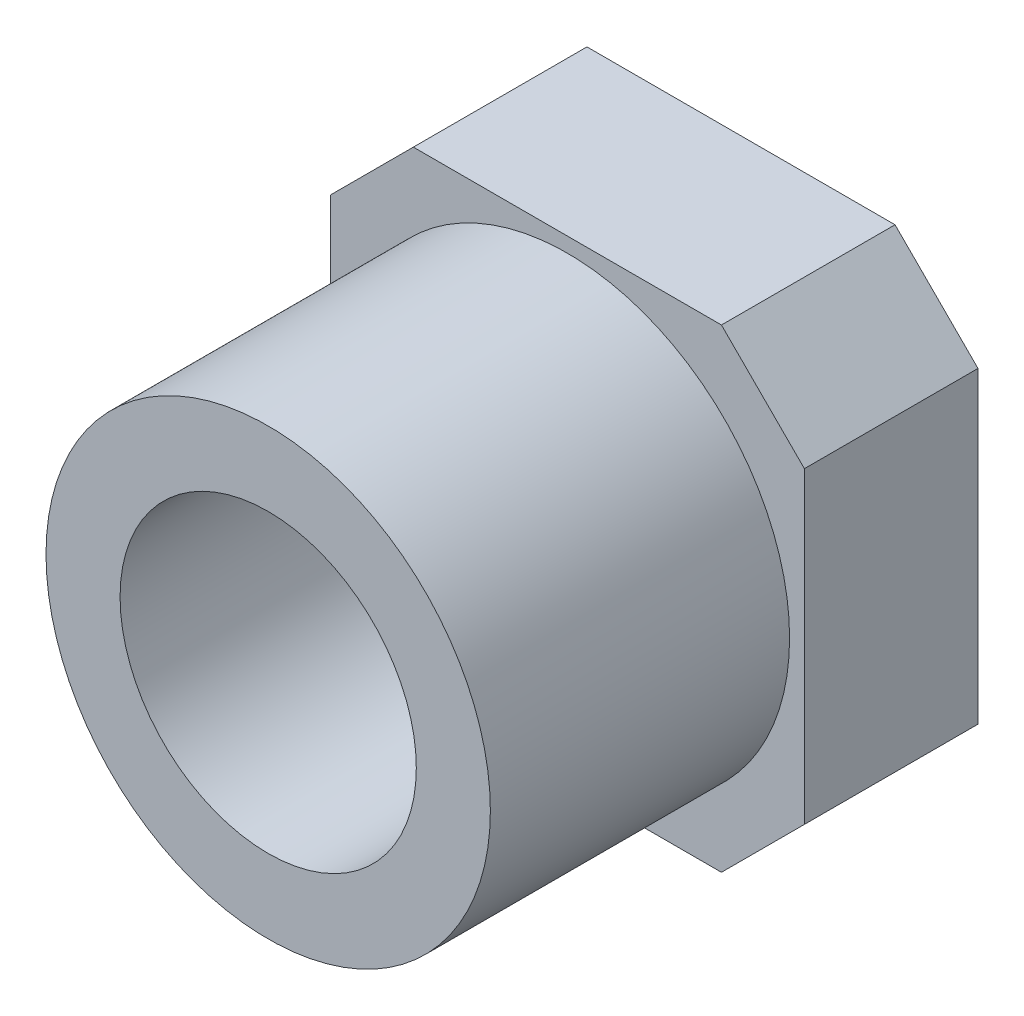
ISO-10303-21;
HEADER;
FILE_DESCRIPTION(('STEP AP214'),'2;1');
FILE_NAME('part.step','',(''),(''),'','','');
FILE_SCHEMA(('AUTOMOTIVE_DESIGN { 1 0 10303 214 1 1 1 1 }'));
ENDSEC;
DATA;
#1=APPLICATION_CONTEXT('core data for automotive mechanical design processes');
#2=APPLICATION_PROTOCOL_DEFINITION('international standard','automotive_design',2000,#1);
#3=PRODUCT_CONTEXT('',#1,'mechanical');
#4=PRODUCT('Part','Part','',(#3));
#5=PRODUCT_RELATED_PRODUCT_CATEGORY('part','',(#4));
#6=PRODUCT_DEFINITION_FORMATION('','',#4);
#7=PRODUCT_DEFINITION_CONTEXT('part definition',#1,'design');
#8=PRODUCT_DEFINITION('design','',#6,#7);
#9=PRODUCT_DEFINITION_SHAPE('','',#8);
#10=(LENGTH_UNIT() NAMED_UNIT(*) SI_UNIT(.MILLI.,.METRE.));
#11=(NAMED_UNIT(*) PLANE_ANGLE_UNIT() SI_UNIT($,.RADIAN.));
#12=(NAMED_UNIT(*) SI_UNIT($,.STERADIAN.) SOLID_ANGLE_UNIT());
#13=UNCERTAINTY_MEASURE_WITH_UNIT(LENGTH_MEASURE(1.E-05),#10,'distance_accuracy_value','');
#14=(GEOMETRIC_REPRESENTATION_CONTEXT(3) GLOBAL_UNCERTAINTY_ASSIGNED_CONTEXT((#13)) GLOBAL_UNIT_ASSIGNED_CONTEXT((#10,
#11,#12)) REPRESENTATION_CONTEXT('',''));
#15=CARTESIAN_POINT('',(0.,0.,0.));
#16=DIRECTION('',(0.,0.,1.));
#17=DIRECTION('',(1.,0.,0.));
#18=AXIS2_PLACEMENT_3D('',#15,#16,#17);
#19=CARTESIAN_POINT('',(0.,0.,12.827));
#20=DIRECTION('',(0.,0.,1.));
#21=DIRECTION('',(1.,0.,0.));
#22=AXIS2_PLACEMENT_3D('',#19,#20,#21);
#23=PLANE('',#22);
#24=CARTESIAN_POINT('',(0.,0.,12.827));
#25=DIRECTION('',(0.,0.,1.));
#26=DIRECTION('',(1.,0.,0.));
#27=AXIS2_PLACEMENT_3D('',#24,#25,#26);
#28=CIRCLE('',#27,9.525);
#29=CARTESIAN_POINT('',(9.525,0.,12.827));
#30=VERTEX_POINT('',#29);
#31=EDGE_CURVE('E141',#30,#30,#28,.T.);
#32=ORIENTED_EDGE('',*,*,#31,.T.);
#33=EDGE_LOOP('',(#32));
#34=FACE_BOUND('',#33,.T.);
#35=CARTESIAN_POINT('',(0.,0.,12.827));
#36=DIRECTION('',(0.,0.,1.));
#37=DIRECTION('',(1.,0.,0.));
#38=AXIS2_PLACEMENT_3D('',#35,#36,#37);
#39=CIRCLE('',#38,6.35);
#40=CARTESIAN_POINT('',(6.35,0.,12.827));
#41=VERTEX_POINT('',#40);
#42=EDGE_CURVE('E138',#41,#41,#39,.T.);
#43=ORIENTED_EDGE('',*,*,#42,.F.);
#44=EDGE_LOOP('',(#43));
#45=FACE_BOUND('',#44,.T.);
#46=ADVANCED_FACE('F33',(#34,#45),#23,.T.);
#47=CARTESIAN_POINT('',(0.,0.,12.827));
#48=DIRECTION('',(0.,0.,-1.));
#49=DIRECTION('',(-1.,0.,0.));
#50=AXIS2_PLACEMENT_3D('',#47,#48,#49);
#51=CYLINDRICAL_SURFACE('',#50,9.525);
#52=ORIENTED_EDGE('',*,*,#31,.F.);
#53=EDGE_LOOP('',(#52));
#54=FACE_BOUND('',#53,.T.);
#55=CARTESIAN_POINT('',(0.,0.,0.));
#56=DIRECTION('',(0.,0.,1.));
#57=DIRECTION('',(1.,0.,0.));
#58=AXIS2_PLACEMENT_3D('',#55,#56,#57);
#59=CIRCLE('',#58,9.525);
#60=CARTESIAN_POINT('',(9.525,0.,0.));
#61=VERTEX_POINT('',#60);
#62=EDGE_CURVE('E135',#61,#61,#59,.T.);
#63=ORIENTED_EDGE('',*,*,#62,.T.);
#64=EDGE_LOOP('',(#63));
#65=FACE_BOUND('',#64,.T.);
#66=ADVANCED_FACE('F203',(#54,#65),#51,.T.);
#67=CARTESIAN_POINT('',(0.,0.,12.827));
#68=DIRECTION('',(0.,0.,-1.));
#69=DIRECTION('',(-1.,0.,0.));
#70=AXIS2_PLACEMENT_3D('',#67,#68,#69);
#71=CYLINDRICAL_SURFACE('',#70,6.35);
#72=ORIENTED_EDGE('',*,*,#42,.T.);
#73=EDGE_LOOP('',(#72));
#74=FACE_BOUND('',#73,.T.);
#75=CARTESIAN_POINT('',(0.,0.,-7.4422));
#76=DIRECTION('',(0.,0.,-1.));
#77=DIRECTION('',(-1.,0.,0.));
#78=AXIS2_PLACEMENT_3D('',#75,#76,#77);
#79=CIRCLE('',#78,6.35);
#80=CARTESIAN_POINT('',(-6.35,0.,-7.4422));
#81=VERTEX_POINT('',#80);
#82=EDGE_CURVE('E173',#81,#81,#79,.T.);
#83=ORIENTED_EDGE('',*,*,#82,.T.);
#84=EDGE_LOOP('',(#83));
#85=FACE_BOUND('',#84,.T.);
#86=ADVANCED_FACE('F209',(#74,#85),#71,.F.);
#87=CARTESIAN_POINT('',(0.,0.,0.));
#88=DIRECTION('',(0.,0.,1.));
#89=DIRECTION('',(1.,0.,0.));
#90=AXIS2_PLACEMENT_3D('',#87,#88,#89);
#91=PLANE('',#90);
#92=DIRECTION('',(-1.,0.,0.));
#93=VECTOR('',#92,1.);
#94=CARTESIAN_POINT('',(10.16,-10.16,0.));
#95=LINE('',#94,#93);
#96=CARTESIAN_POINT('',(6.604,-10.16,0.));
#97=VERTEX_POINT('',#96);
#98=CARTESIAN_POINT('',(-6.60399999999998,-10.16,0.));
#99=VERTEX_POINT('',#98);
#100=EDGE_CURVE('E116',#97,#99,#95,.T.);
#101=ORIENTED_EDGE('',*,*,#100,.F.);
#102=DIRECTION('',(-0.707106781186546,-0.707106781186549,0.));
#103=VECTOR('',#102,1.);
#104=CARTESIAN_POINT('',(8.38200000000001,-8.38199999999998,0.));
#105=LINE('',#104,#103);
#106=CARTESIAN_POINT('',(10.16,-6.60399999999999,0.));
#107=VERTEX_POINT('',#106);
#108=EDGE_CURVE('E99',#97,#107,#105,.F.);
#109=ORIENTED_EDGE('',*,*,#108,.T.);
#110=DIRECTION('',(0.,-1.,0.));
#111=VECTOR('',#110,1.);
#112=CARTESIAN_POINT('',(10.16,-10.16,0.));
#113=LINE('',#112,#111);
#114=CARTESIAN_POINT('',(10.16,6.604,0.));
#115=VERTEX_POINT('',#114);
#116=EDGE_CURVE('E127',#115,#107,#113,.T.);
#117=ORIENTED_EDGE('',*,*,#116,.F.);
#118=DIRECTION('',(0.707106781186549,-0.707106781186546,0.));
#119=VECTOR('',#118,1.);
#120=CARTESIAN_POINT('',(8.38199999999998,8.38200000000001,0.));
#121=LINE('',#120,#119);
#122=CARTESIAN_POINT('',(6.60399999999999,10.16,0.));
#123=VERTEX_POINT('',#122);
#124=EDGE_CURVE('E120',#115,#123,#121,.F.);
#125=ORIENTED_EDGE('',*,*,#124,.T.);
#126=DIRECTION('',(1.,0.,0.));
#127=VECTOR('',#126,1.);
#128=CARTESIAN_POINT('',(10.16,10.16,0.));
#129=LINE('',#128,#127);
#130=CARTESIAN_POINT('',(-6.604,10.16,0.));
#131=VERTEX_POINT('',#130);
#132=EDGE_CURVE('E131',#131,#123,#129,.T.);
#133=ORIENTED_EDGE('',*,*,#132,.F.);
#134=DIRECTION('',(0.707106781186546,0.707106781186549,0.));
#135=VECTOR('',#134,1.);
#136=CARTESIAN_POINT('',(-8.38200000000002,8.38199999999998,0.));
#137=LINE('',#136,#135);
#138=CARTESIAN_POINT('',(-10.16,6.60399999999999,0.));
#139=VERTEX_POINT('',#138);
#140=EDGE_CURVE('E146',#131,#139,#137,.F.);
#141=ORIENTED_EDGE('',*,*,#140,.T.);
#142=DIRECTION('',(0.,1.,0.));
#143=VECTOR('',#142,1.);
#144=CARTESIAN_POINT('',(-10.16,-10.16,0.));
#145=LINE('',#144,#143);
#146=CARTESIAN_POINT('',(-10.16,-6.604,0.));
#147=VERTEX_POINT('',#146);
#148=EDGE_CURVE('E168',#147,#139,#145,.T.);
#149=ORIENTED_EDGE('',*,*,#148,.F.);
#150=DIRECTION('',(-0.707106781186549,0.707106781186546,0.));
#151=VECTOR('',#150,1.);
#152=CARTESIAN_POINT('',(-8.38199999999998,-8.38200000000001,0.));
#153=LINE('',#152,#151);
#154=EDGE_CURVE('E110',#147,#99,#153,.F.);
#155=ORIENTED_EDGE('',*,*,#154,.T.);
#156=EDGE_LOOP('',(#101,#109,#117,#125,#133,#141,#149,#155));
#157=FACE_BOUND('',#156,.T.);
#158=ORIENTED_EDGE('',*,*,#62,.F.);
#159=EDGE_LOOP('',(#158));
#160=FACE_BOUND('',#159,.T.);
#161=ADVANCED_FACE('F123',(#157,#160),#91,.T.);
#162=CARTESIAN_POINT('',(0.,0.,-7.4422));
#163=DIRECTION('',(0.,0.,1.));
#164=DIRECTION('',(1.,0.,0.));
#165=AXIS2_PLACEMENT_3D('',#162,#163,#164);
#166=PLANE('',#165);
#167=DIRECTION('',(0.,-1.,0.));
#168=VECTOR('',#167,1.);
#169=CARTESIAN_POINT('',(10.16,-10.16,-7.4422));
#170=LINE('',#169,#168);
#171=CARTESIAN_POINT('',(10.16,6.604,-7.4422));
#172=VERTEX_POINT('',#171);
#173=CARTESIAN_POINT('',(10.16,-6.60399999999999,-7.4422));
#174=VERTEX_POINT('',#173);
#175=EDGE_CURVE('E179',#172,#174,#170,.T.);
#176=ORIENTED_EDGE('',*,*,#175,.T.);
#177=DIRECTION('',(0.707106781186546,0.707106781186549,0.));
#178=VECTOR('',#177,1.);
#179=CARTESIAN_POINT('',(6.604,-10.16,-7.4422));
#180=LINE('',#179,#178);
#181=CARTESIAN_POINT('',(6.604,-10.16,-7.4422));
#182=VERTEX_POINT('',#181);
#183=EDGE_CURVE('E157',#174,#182,#180,.F.);
#184=ORIENTED_EDGE('',*,*,#183,.T.);
#185=DIRECTION('',(-1.,0.,0.));
#186=VECTOR('',#185,1.);
#187=CARTESIAN_POINT('',(10.16,-10.16,-7.4422));
#188=LINE('',#187,#186);
#189=CARTESIAN_POINT('',(-6.60399999999998,-10.16,-7.4422));
#190=VERTEX_POINT('',#189);
#191=EDGE_CURVE('E119',#182,#190,#188,.T.);
#192=ORIENTED_EDGE('',*,*,#191,.T.);
#193=DIRECTION('',(0.707106781186549,-0.707106781186546,0.));
#194=VECTOR('',#193,1.);
#195=CARTESIAN_POINT('',(-10.16,-6.604,-7.4422));
#196=LINE('',#195,#194);
#197=CARTESIAN_POINT('',(-10.16,-6.604,-7.4422));
#198=VERTEX_POINT('',#197);
#199=EDGE_CURVE('E155',#190,#198,#196,.F.);
#200=ORIENTED_EDGE('',*,*,#199,.T.);
#201=DIRECTION('',(0.,1.,0.));
#202=VECTOR('',#201,1.);
#203=CARTESIAN_POINT('',(-10.16,-10.16,-7.4422));
#204=LINE('',#203,#202);
#205=CARTESIAN_POINT('',(-10.16,6.60399999999999,-7.4422));
#206=VERTEX_POINT('',#205);
#207=EDGE_CURVE('E126',#198,#206,#204,.T.);
#208=ORIENTED_EDGE('',*,*,#207,.T.);
#209=DIRECTION('',(-0.707106781186546,-0.707106781186549,0.));
#210=VECTOR('',#209,1.);
#211=CARTESIAN_POINT('',(-6.60400000000001,10.16,-7.4422));
#212=LINE('',#211,#210);
#213=CARTESIAN_POINT('',(-6.60400000000001,10.16,-7.4422));
#214=VERTEX_POINT('',#213);
#215=EDGE_CURVE('E54',#206,#214,#212,.F.);
#216=ORIENTED_EDGE('',*,*,#215,.T.);
#217=DIRECTION('',(1.,0.,0.));
#218=VECTOR('',#217,1.);
#219=CARTESIAN_POINT('',(10.16,10.16,-7.4422));
#220=LINE('',#219,#218);
#221=CARTESIAN_POINT('',(6.60399999999999,10.16,-7.4422));
#222=VERTEX_POINT('',#221);
#223=EDGE_CURVE('E129',#214,#222,#220,.T.);
#224=ORIENTED_EDGE('',*,*,#223,.T.);
#225=DIRECTION('',(-0.707106781186549,0.707106781186546,0.));
#226=VECTOR('',#225,1.);
#227=CARTESIAN_POINT('',(10.16,6.604,-7.4422));
#228=LINE('',#227,#226);
#229=EDGE_CURVE('E152',#222,#172,#228,.F.);
#230=ORIENTED_EDGE('',*,*,#229,.T.);
#231=EDGE_LOOP('',(#176,#184,#192,#200,#208,#216,#224,#230));
#232=FACE_BOUND('',#231,.T.);
#233=ORIENTED_EDGE('',*,*,#82,.F.);
#234=EDGE_LOOP('',(#233));
#235=FACE_BOUND('',#234,.T.);
#236=ADVANCED_FACE('F183',(#232,#235),#166,.F.);
#237=CARTESIAN_POINT('',(-10.16,-10.16,-7.4422));
#238=DIRECTION('',(1.,0.,0.));
#239=DIRECTION('',(0.,0.,-1.));
#240=AXIS2_PLACEMENT_3D('',#237,#238,#239);
#241=PLANE('',#240);
#242=ORIENTED_EDGE('',*,*,#207,.F.);
#243=DIRECTION('',(0.,0.,1.));
#244=VECTOR('',#243,1.);
#245=CARTESIAN_POINT('',(-10.16,-6.604,-7.4422));
#246=LINE('',#245,#244);
#247=EDGE_CURVE('E161',#198,#147,#246,.T.);
#248=ORIENTED_EDGE('',*,*,#247,.T.);
#249=ORIENTED_EDGE('',*,*,#148,.T.);
#250=DIRECTION('',(0.,0.,-1.));
#251=VECTOR('',#250,1.);
#252=CARTESIAN_POINT('',(-10.16,6.60399999999999,-7.4422));
#253=LINE('',#252,#251);
#254=EDGE_CURVE('E159',#139,#206,#253,.T.);
#255=ORIENTED_EDGE('',*,*,#254,.T.);
#256=EDGE_LOOP('',(#242,#248,#249,#255));
#257=FACE_BOUND('',#256,.T.);
#258=ADVANCED_FACE('F167',(#257),#241,.F.);
#259=CARTESIAN_POINT('',(10.16,10.16,-7.4422));
#260=DIRECTION('',(0.,-1.,0.));
#261=DIRECTION('',(0.,0.,-1.));
#262=AXIS2_PLACEMENT_3D('',#259,#260,#261);
#263=PLANE('',#262);
#264=ORIENTED_EDGE('',*,*,#223,.F.);
#265=DIRECTION('',(0.,0.,1.));
#266=VECTOR('',#265,1.);
#267=CARTESIAN_POINT('',(-6.60400000000001,10.16,-7.4422));
#268=LINE('',#267,#266);
#269=EDGE_CURVE('E11',#214,#131,#268,.T.);
#270=ORIENTED_EDGE('',*,*,#269,.T.);
#271=ORIENTED_EDGE('',*,*,#132,.T.);
#272=DIRECTION('',(0.,0.,-1.));
#273=VECTOR('',#272,1.);
#274=CARTESIAN_POINT('',(6.60399999999999,10.16,-7.4422));
#275=LINE('',#274,#273);
#276=EDGE_CURVE('E41',#123,#222,#275,.T.);
#277=ORIENTED_EDGE('',*,*,#276,.T.);
#278=EDGE_LOOP('',(#264,#270,#271,#277));
#279=FACE_BOUND('',#278,.T.);
#280=ADVANCED_FACE('F191',(#279),#263,.F.);
#281=CARTESIAN_POINT('',(10.16,-10.16,-7.4422));
#282=DIRECTION('',(-1.,0.,0.));
#283=DIRECTION('',(0.,0.,1.));
#284=AXIS2_PLACEMENT_3D('',#281,#282,#283);
#285=PLANE('',#284);
#286=ORIENTED_EDGE('',*,*,#116,.T.);
#287=DIRECTION('',(0.,0.,-1.));
#288=VECTOR('',#287,1.);
#289=CARTESIAN_POINT('',(10.16,-6.60399999999999,-7.4422));
#290=LINE('',#289,#288);
#291=EDGE_CURVE('E104',#107,#174,#290,.T.);
#292=ORIENTED_EDGE('',*,*,#291,.T.);
#293=ORIENTED_EDGE('',*,*,#175,.F.);
#294=DIRECTION('',(0.,0.,1.));
#295=VECTOR('',#294,1.);
#296=CARTESIAN_POINT('',(10.16,6.604,-7.4422));
#297=LINE('',#296,#295);
#298=EDGE_CURVE('E109',#172,#115,#297,.T.);
#299=ORIENTED_EDGE('',*,*,#298,.T.);
#300=EDGE_LOOP('',(#286,#292,#293,#299));
#301=FACE_BOUND('',#300,.T.);
#302=ADVANCED_FACE('F190',(#301),#285,.F.);
#303=CARTESIAN_POINT('',(10.16,-10.16,-7.4422));
#304=DIRECTION('',(0.,1.,0.));
#305=DIRECTION('',(0.,0.,1.));
#306=AXIS2_PLACEMENT_3D('',#303,#304,#305);
#307=PLANE('',#306);
#308=ORIENTED_EDGE('',*,*,#191,.F.);
#309=DIRECTION('',(0.,0.,1.));
#310=VECTOR('',#309,1.);
#311=CARTESIAN_POINT('',(6.604,-10.16,-7.4422));
#312=LINE('',#311,#310);
#313=EDGE_CURVE('E103',#182,#97,#312,.T.);
#314=ORIENTED_EDGE('',*,*,#313,.T.);
#315=ORIENTED_EDGE('',*,*,#100,.T.);
#316=DIRECTION('',(0.,0.,-1.));
#317=VECTOR('',#316,1.);
#318=CARTESIAN_POINT('',(-6.60399999999998,-10.16,-7.4422));
#319=LINE('',#318,#317);
#320=EDGE_CURVE('E121',#99,#190,#319,.T.);
#321=ORIENTED_EDGE('',*,*,#320,.T.);
#322=EDGE_LOOP('',(#308,#314,#315,#321));
#323=FACE_BOUND('',#322,.T.);
#324=ADVANCED_FACE('F115',(#323),#307,.F.);
#325=CARTESIAN_POINT('',(6.604,-10.16,-7.4422));
#326=DIRECTION('',(-0.707106781186549,0.707106781186546,0.));
#327=DIRECTION('',(0.,0.,1.));
#328=AXIS2_PLACEMENT_3D('',#325,#326,#327);
#329=PLANE('',#328);
#330=ORIENTED_EDGE('',*,*,#183,.F.);
#331=ORIENTED_EDGE('',*,*,#291,.F.);
#332=ORIENTED_EDGE('',*,*,#108,.F.);
#333=ORIENTED_EDGE('',*,*,#313,.F.);
#334=EDGE_LOOP('',(#330,#331,#332,#333));
#335=FACE_BOUND('',#334,.T.);
#336=ADVANCED_FACE('F102',(#335),#329,.F.);
#337=CARTESIAN_POINT('',(-10.16,-6.604,-7.4422));
#338=DIRECTION('',(0.707106781186546,0.707106781186549,0.));
#339=DIRECTION('',(0.,0.,1.));
#340=AXIS2_PLACEMENT_3D('',#337,#338,#339);
#341=PLANE('',#340);
#342=ORIENTED_EDGE('',*,*,#199,.F.);
#343=ORIENTED_EDGE('',*,*,#320,.F.);
#344=ORIENTED_EDGE('',*,*,#154,.F.);
#345=ORIENTED_EDGE('',*,*,#247,.F.);
#346=EDGE_LOOP('',(#342,#343,#344,#345));
#347=FACE_BOUND('',#346,.T.);
#348=ADVANCED_FACE('F194',(#347),#341,.F.);
#349=CARTESIAN_POINT('',(-6.60400000000001,10.16,-7.4422));
#350=DIRECTION('',(0.707106781186549,-0.707106781186546,0.));
#351=DIRECTION('',(0.,0.,1.));
#352=AXIS2_PLACEMENT_3D('',#349,#350,#351);
#353=PLANE('',#352);
#354=ORIENTED_EDGE('',*,*,#215,.F.);
#355=ORIENTED_EDGE('',*,*,#254,.F.);
#356=ORIENTED_EDGE('',*,*,#140,.F.);
#357=ORIENTED_EDGE('',*,*,#269,.F.);
#358=EDGE_LOOP('',(#354,#355,#356,#357));
#359=FACE_BOUND('',#358,.T.);
#360=ADVANCED_FACE('F193',(#359),#353,.F.);
#361=CARTESIAN_POINT('',(10.16,6.604,-7.4422));
#362=DIRECTION('',(-0.707106781186546,-0.707106781186549,0.));
#363=DIRECTION('',(0.,0.,1.));
#364=AXIS2_PLACEMENT_3D('',#361,#362,#363);
#365=PLANE('',#364);
#366=ORIENTED_EDGE('',*,*,#229,.F.);
#367=ORIENTED_EDGE('',*,*,#276,.F.);
#368=ORIENTED_EDGE('',*,*,#124,.F.);
#369=ORIENTED_EDGE('',*,*,#298,.F.);
#370=EDGE_LOOP('',(#366,#367,#368,#369));
#371=FACE_BOUND('',#370,.T.);
#372=ADVANCED_FACE('F35',(#371),#365,.F.);
#373=CLOSED_SHELL('',(#46,#66,#86,#161,#236,#258,#280,#302,#324,#336,#348,#360,#372));
#374=MANIFOLD_SOLID_BREP('B2',#373);
#375=ADVANCED_BREP_SHAPE_REPRESENTATION('',(#18,#374),#14);
#376=SHAPE_DEFINITION_REPRESENTATION(#9,#375);
ENDSEC;
END-ISO-10303-21;
